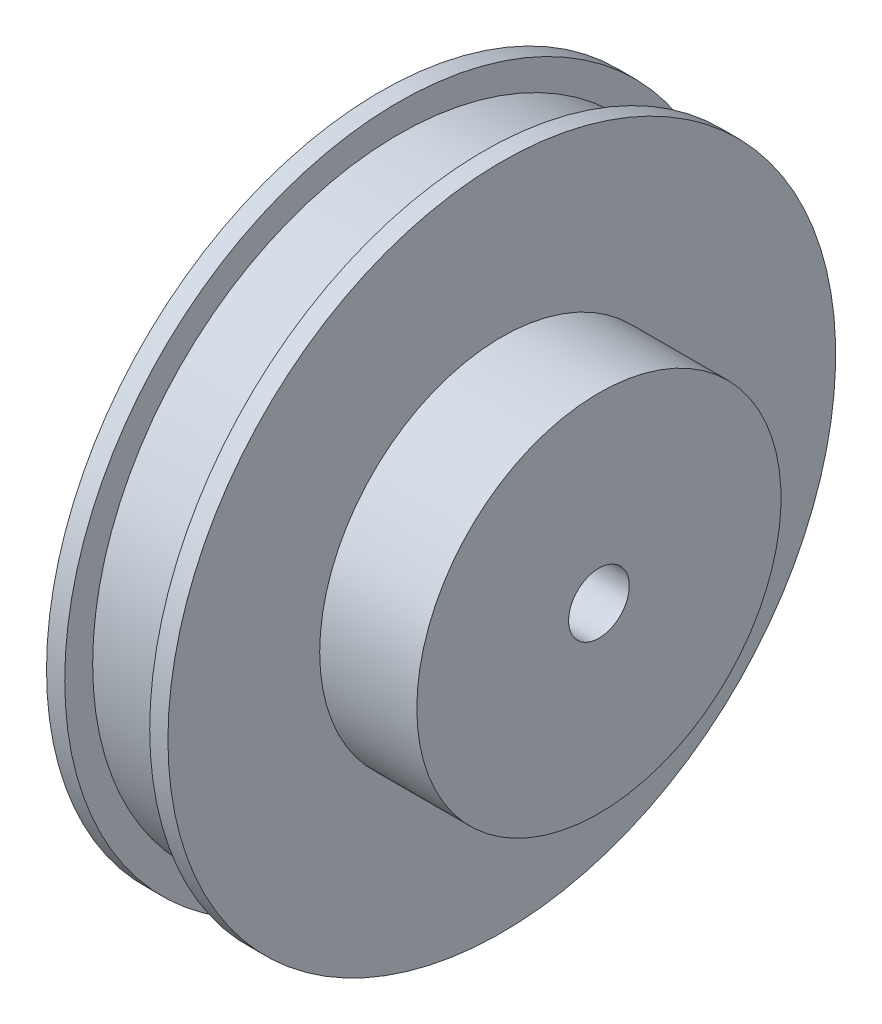
ISO-10303-21;
HEADER;
FILE_DESCRIPTION(('STEP AP214'),'2;1');
FILE_NAME('part.step','',(''),(''),'','','');
FILE_SCHEMA(('AUTOMOTIVE_DESIGN { 1 0 10303 214 1 1 1 1 }'));
ENDSEC;
DATA;
#1=APPLICATION_CONTEXT('core data for automotive mechanical design processes');
#2=APPLICATION_PROTOCOL_DEFINITION('international standard','automotive_design',2000,#1);
#3=PRODUCT_CONTEXT('',#1,'mechanical');
#4=PRODUCT('Part','Part','',(#3));
#5=PRODUCT_RELATED_PRODUCT_CATEGORY('part','',(#4));
#6=PRODUCT_DEFINITION_FORMATION('','',#4);
#7=PRODUCT_DEFINITION_CONTEXT('part definition',#1,'design');
#8=PRODUCT_DEFINITION('design','',#6,#7);
#9=PRODUCT_DEFINITION_SHAPE('','',#8);
#10=(LENGTH_UNIT() NAMED_UNIT(*) SI_UNIT(.MILLI.,.METRE.));
#11=(NAMED_UNIT(*) PLANE_ANGLE_UNIT() SI_UNIT($,.RADIAN.));
#12=(NAMED_UNIT(*) SI_UNIT($,.STERADIAN.) SOLID_ANGLE_UNIT());
#13=UNCERTAINTY_MEASURE_WITH_UNIT(LENGTH_MEASURE(1.E-05),#10,'distance_accuracy_value','');
#14=(GEOMETRIC_REPRESENTATION_CONTEXT(3) GLOBAL_UNCERTAINTY_ASSIGNED_CONTEXT((#13)) GLOBAL_UNIT_ASSIGNED_CONTEXT((#10,
#11,#12)) REPRESENTATION_CONTEXT('',''));
#15=CARTESIAN_POINT('',(0.,0.,0.));
#16=DIRECTION('',(0.,0.,1.));
#17=DIRECTION('',(1.,0.,0.));
#18=AXIS2_PLACEMENT_3D('',#15,#16,#17);
#19=CARTESIAN_POINT('',(-19.6819568499624,0.,0.));
#20=DIRECTION('',(-1.,0.,0.));
#21=DIRECTION('',(0.,0.,1.));
#22=AXIS2_PLACEMENT_3D('',#19,#20,#21);
#23=CYLINDRICAL_SURFACE('',#22,27.5);
#24=CARTESIAN_POINT('',(0.,0.,0.));
#25=DIRECTION('',(-1.,0.,0.));
#26=DIRECTION('',(0.,0.,1.));
#27=AXIS2_PLACEMENT_3D('',#24,#25,#26);
#28=CIRCLE('',#27,27.5);
#29=CARTESIAN_POINT('',(0.,0.,27.5));
#30=VERTEX_POINT('',#29);
#31=EDGE_CURVE('E73',#30,#30,#28,.T.);
#32=ORIENTED_EDGE('',*,*,#31,.F.);
#33=EDGE_LOOP('',(#32));
#34=FACE_BOUND('',#33,.T.);
#35=CARTESIAN_POINT('',(1.5,0.,0.));
#36=DIRECTION('',(-1.,0.,0.));
#37=DIRECTION('',(0.,0.,1.));
#38=AXIS2_PLACEMENT_3D('',#35,#36,#37);
#39=CIRCLE('',#38,27.5);
#40=CARTESIAN_POINT('',(1.5,0.,27.5));
#41=VERTEX_POINT('',#40);
#42=EDGE_CURVE('E10',#41,#41,#39,.T.);
#43=ORIENTED_EDGE('',*,*,#42,.T.);
#44=EDGE_LOOP('',(#43));
#45=FACE_BOUND('',#44,.T.);
#46=ADVANCED_FACE('F39',(#34,#45),#23,.T.);
#47=CARTESIAN_POINT('',(1.5,27.5,0.));
#48=DIRECTION('',(-1.,0.,0.));
#49=DIRECTION('',(0.,0.,1.));
#50=AXIS2_PLACEMENT_3D('',#47,#48,#49);
#51=PLANE('',#50);
#52=ORIENTED_EDGE('',*,*,#42,.F.);
#53=EDGE_LOOP('',(#52));
#54=FACE_BOUND('',#53,.T.);
#55=CARTESIAN_POINT('',(1.5,0.,0.));
#56=DIRECTION('',(-1.,0.,0.));
#57=DIRECTION('',(0.,0.,1.));
#58=AXIS2_PLACEMENT_3D('',#55,#56,#57);
#59=CIRCLE('',#58,25.2);
#60=CARTESIAN_POINT('',(1.5,0.,25.2));
#61=VERTEX_POINT('',#60);
#62=EDGE_CURVE('E45',#61,#61,#59,.T.);
#63=ORIENTED_EDGE('',*,*,#62,.T.);
#64=EDGE_LOOP('',(#63));
#65=FACE_BOUND('',#64,.T.);
#66=ADVANCED_FACE('F80',(#54,#65),#51,.F.);
#67=CARTESIAN_POINT('',(-19.6819568499624,0.,0.));
#68=DIRECTION('',(-1.,0.,0.));
#69=DIRECTION('',(0.,0.,1.));
#70=AXIS2_PLACEMENT_3D('',#67,#68,#69);
#71=CYLINDRICAL_SURFACE('',#70,25.2);
#72=ORIENTED_EDGE('',*,*,#62,.F.);
#73=EDGE_LOOP('',(#72));
#74=FACE_BOUND('',#73,.T.);
#75=CARTESIAN_POINT('',(8.5,0.,0.));
#76=DIRECTION('',(-1.,0.,0.));
#77=DIRECTION('',(0.,0.,1.));
#78=AXIS2_PLACEMENT_3D('',#75,#76,#77);
#79=CIRCLE('',#78,25.2);
#80=CARTESIAN_POINT('',(8.5,0.,25.2));
#81=VERTEX_POINT('',#80);
#82=EDGE_CURVE('E49',#81,#81,#79,.T.);
#83=ORIENTED_EDGE('',*,*,#82,.T.);
#84=EDGE_LOOP('',(#83));
#85=FACE_BOUND('',#84,.T.);
#86=ADVANCED_FACE('F84',(#74,#85),#71,.T.);
#87=CARTESIAN_POINT('',(8.5,25.2,0.));
#88=DIRECTION('',(1.,0.,0.));
#89=DIRECTION('',(0.,0.,-1.));
#90=AXIS2_PLACEMENT_3D('',#87,#88,#89);
#91=PLANE('',#90);
#92=ORIENTED_EDGE('',*,*,#82,.F.);
#93=EDGE_LOOP('',(#92));
#94=FACE_BOUND('',#93,.T.);
#95=CARTESIAN_POINT('',(8.5,0.,0.));
#96=DIRECTION('',(-1.,0.,0.));
#97=DIRECTION('',(0.,0.,1.));
#98=AXIS2_PLACEMENT_3D('',#95,#96,#97);
#99=CIRCLE('',#98,27.5);
#100=CARTESIAN_POINT('',(8.5,0.,27.5));
#101=VERTEX_POINT('',#100);
#102=EDGE_CURVE('E53',#101,#101,#99,.T.);
#103=ORIENTED_EDGE('',*,*,#102,.T.);
#104=EDGE_LOOP('',(#103));
#105=FACE_BOUND('',#104,.T.);
#106=ADVANCED_FACE('F89',(#94,#105),#91,.F.);
#107=CARTESIAN_POINT('',(-19.6819568499624,0.,0.));
#108=DIRECTION('',(-1.,0.,0.));
#109=DIRECTION('',(0.,0.,1.));
#110=AXIS2_PLACEMENT_3D('',#107,#108,#109);
#111=CYLINDRICAL_SURFACE('',#110,27.5);
#112=ORIENTED_EDGE('',*,*,#102,.F.);
#113=EDGE_LOOP('',(#112));
#114=FACE_BOUND('',#113,.T.);
#115=CARTESIAN_POINT('',(10.,0.,0.));
#116=DIRECTION('',(-1.,0.,0.));
#117=DIRECTION('',(0.,0.,1.));
#118=AXIS2_PLACEMENT_3D('',#115,#116,#117);
#119=CIRCLE('',#118,27.5);
#120=CARTESIAN_POINT('',(10.,0.,27.5));
#121=VERTEX_POINT('',#120);
#122=EDGE_CURVE('E58',#121,#121,#119,.T.);
#123=ORIENTED_EDGE('',*,*,#122,.T.);
#124=EDGE_LOOP('',(#123));
#125=FACE_BOUND('',#124,.T.);
#126=ADVANCED_FACE('F95',(#114,#125),#111,.T.);
#127=CARTESIAN_POINT('',(10.,27.5,0.));
#128=DIRECTION('',(-1.,0.,0.));
#129=DIRECTION('',(0.,0.,1.));
#130=AXIS2_PLACEMENT_3D('',#127,#128,#129);
#131=PLANE('',#130);
#132=ORIENTED_EDGE('',*,*,#122,.F.);
#133=EDGE_LOOP('',(#132));
#134=FACE_BOUND('',#133,.T.);
#135=CARTESIAN_POINT('',(10.,0.,0.));
#136=DIRECTION('',(-1.,0.,0.));
#137=DIRECTION('',(0.,0.,1.));
#138=AXIS2_PLACEMENT_3D('',#135,#136,#137);
#139=CIRCLE('',#138,15.);
#140=CARTESIAN_POINT('',(10.,0.,15.));
#141=VERTEX_POINT('',#140);
#142=EDGE_CURVE('E61',#141,#141,#139,.T.);
#143=ORIENTED_EDGE('',*,*,#142,.T.);
#144=EDGE_LOOP('',(#143));
#145=FACE_BOUND('',#144,.T.);
#146=ADVANCED_FACE('F99',(#134,#145),#131,.F.);
#147=CARTESIAN_POINT('',(-19.6819568499624,0.,0.));
#148=DIRECTION('',(-1.,0.,0.));
#149=DIRECTION('',(0.,0.,1.));
#150=AXIS2_PLACEMENT_3D('',#147,#148,#149);
#151=CYLINDRICAL_SURFACE('',#150,15.);
#152=ORIENTED_EDGE('',*,*,#142,.F.);
#153=EDGE_LOOP('',(#152));
#154=FACE_BOUND('',#153,.T.);
#155=CARTESIAN_POINT('',(18.,0.,0.));
#156=DIRECTION('',(-1.,0.,0.));
#157=DIRECTION('',(0.,0.,1.));
#158=AXIS2_PLACEMENT_3D('',#155,#156,#157);
#159=CIRCLE('',#158,15.);
#160=CARTESIAN_POINT('',(18.,0.,15.));
#161=VERTEX_POINT('',#160);
#162=EDGE_CURVE('E64',#161,#161,#159,.T.);
#163=ORIENTED_EDGE('',*,*,#162,.T.);
#164=EDGE_LOOP('',(#163));
#165=FACE_BOUND('',#164,.T.);
#166=ADVANCED_FACE('F103',(#154,#165),#151,.T.);
#167=CARTESIAN_POINT('',(18.,15.,0.));
#168=DIRECTION('',(-1.,0.,0.));
#169=DIRECTION('',(0.,0.,1.));
#170=AXIS2_PLACEMENT_3D('',#167,#168,#169);
#171=PLANE('',#170);
#172=ORIENTED_EDGE('',*,*,#162,.F.);
#173=EDGE_LOOP('',(#172));
#174=FACE_BOUND('',#173,.T.);
#175=CARTESIAN_POINT('',(18.,0.,0.));
#176=DIRECTION('',(-1.,0.,0.));
#177=DIRECTION('',(0.,0.,1.));
#178=AXIS2_PLACEMENT_3D('',#175,#176,#177);
#179=CIRCLE('',#178,2.5);
#180=CARTESIAN_POINT('',(18.,0.,2.5));
#181=VERTEX_POINT('',#180);
#182=EDGE_CURVE('E67',#181,#181,#179,.T.);
#183=ORIENTED_EDGE('',*,*,#182,.T.);
#184=EDGE_LOOP('',(#183));
#185=FACE_BOUND('',#184,.T.);
#186=ADVANCED_FACE('F107',(#174,#185),#171,.F.);
#187=CARTESIAN_POINT('',(-19.6819568499624,0.,0.));
#188=DIRECTION('',(-1.,0.,0.));
#189=DIRECTION('',(0.,0.,1.));
#190=AXIS2_PLACEMENT_3D('',#187,#188,#189);
#191=CYLINDRICAL_SURFACE('',#190,2.5);
#192=ORIENTED_EDGE('',*,*,#182,.F.);
#193=EDGE_LOOP('',(#192));
#194=FACE_BOUND('',#193,.T.);
#195=CARTESIAN_POINT('',(0.,0.,0.));
#196=DIRECTION('',(-1.,0.,0.));
#197=DIRECTION('',(0.,0.,1.));
#198=AXIS2_PLACEMENT_3D('',#195,#196,#197);
#199=CIRCLE('',#198,2.5);
#200=CARTESIAN_POINT('',(0.,0.,2.5));
#201=VERTEX_POINT('',#200);
#202=EDGE_CURVE('E70',#201,#201,#199,.T.);
#203=ORIENTED_EDGE('',*,*,#202,.T.);
#204=EDGE_LOOP('',(#203));
#205=FACE_BOUND('',#204,.T.);
#206=ADVANCED_FACE('F111',(#194,#205),#191,.F.);
#207=CARTESIAN_POINT('',(0.,2.5,0.));
#208=DIRECTION('',(1.,0.,0.));
#209=DIRECTION('',(0.,0.,-1.));
#210=AXIS2_PLACEMENT_3D('',#207,#208,#209);
#211=PLANE('',#210);
#212=ORIENTED_EDGE('',*,*,#202,.F.);
#213=EDGE_LOOP('',(#212));
#214=FACE_BOUND('',#213,.T.);
#215=ORIENTED_EDGE('',*,*,#31,.T.);
#216=EDGE_LOOP('',(#215));
#217=FACE_BOUND('',#216,.T.);
#218=ADVANCED_FACE('F77',(#214,#217),#211,.F.);
#219=CLOSED_SHELL('',(#46,#66,#86,#106,#126,#146,#166,#186,#206,#218));
#220=MANIFOLD_SOLID_BREP('B2',#219);
#221=ADVANCED_BREP_SHAPE_REPRESENTATION('',(#18,#220),#14);
#222=SHAPE_DEFINITION_REPRESENTATION(#9,#221);
ENDSEC;
END-ISO-10303-21;
